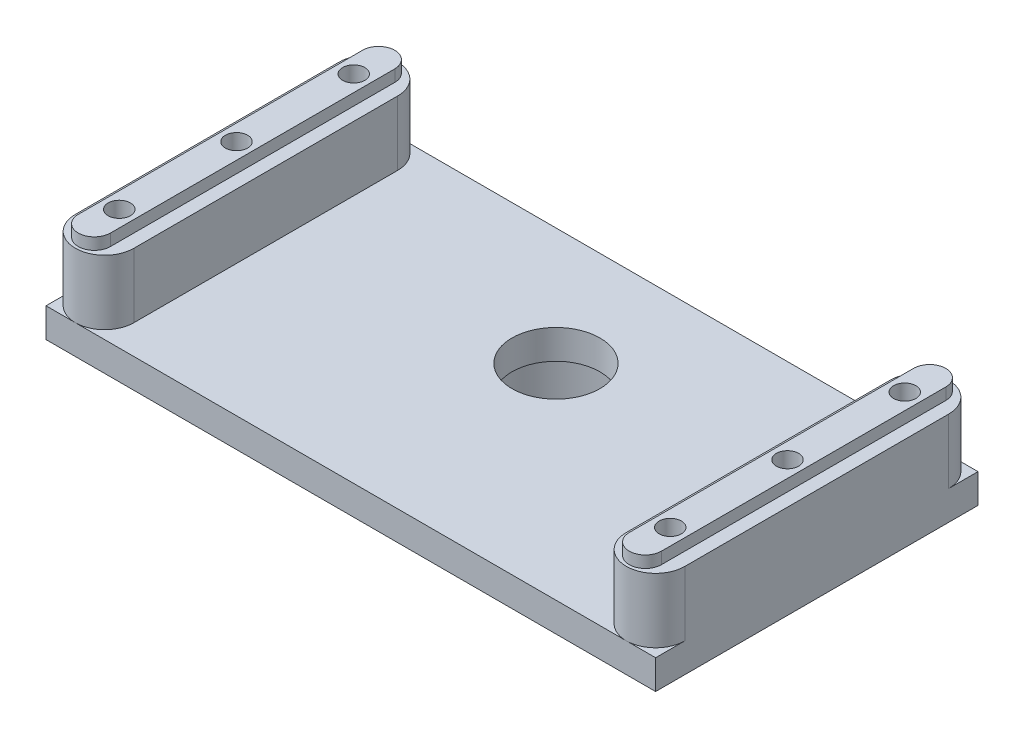
ISO-10303-21;
HEADER;
FILE_DESCRIPTION(('STEP AP214'),'2;1');
FILE_NAME('part.step','',(''),(''),'','','');
FILE_SCHEMA(('AUTOMOTIVE_DESIGN { 1 0 10303 214 1 1 1 1 }'));
ENDSEC;
DATA;
#1=APPLICATION_CONTEXT('core data for automotive mechanical design processes');
#2=APPLICATION_PROTOCOL_DEFINITION('international standard','automotive_design',2000,#1);
#3=PRODUCT_CONTEXT('',#1,'mechanical');
#4=PRODUCT('Part','Part','',(#3));
#5=PRODUCT_RELATED_PRODUCT_CATEGORY('part','',(#4));
#6=PRODUCT_DEFINITION_FORMATION('','',#4);
#7=PRODUCT_DEFINITION_CONTEXT('part definition',#1,'design');
#8=PRODUCT_DEFINITION('design','',#6,#7);
#9=PRODUCT_DEFINITION_SHAPE('','',#8);
#10=(LENGTH_UNIT() NAMED_UNIT(*) SI_UNIT(.MILLI.,.METRE.));
#11=(NAMED_UNIT(*) PLANE_ANGLE_UNIT() SI_UNIT($,.RADIAN.));
#12=(NAMED_UNIT(*) SI_UNIT($,.STERADIAN.) SOLID_ANGLE_UNIT());
#13=UNCERTAINTY_MEASURE_WITH_UNIT(LENGTH_MEASURE(1.E-05),#10,'distance_accuracy_value','');
#14=(GEOMETRIC_REPRESENTATION_CONTEXT(3) GLOBAL_UNCERTAINTY_ASSIGNED_CONTEXT((#13)) GLOBAL_UNIT_ASSIGNED_CONTEXT((#10,
#11,#12)) REPRESENTATION_CONTEXT('',''));
#15=CARTESIAN_POINT('',(0.,0.,0.));
#16=DIRECTION('',(0.,0.,1.));
#17=DIRECTION('',(1.,0.,0.));
#18=AXIS2_PLACEMENT_3D('',#15,#16,#17);
#19=CARTESIAN_POINT('',(47.,16.,22.5));
#20=DIRECTION('',(0.,1.,0.));
#21=DIRECTION('',(0.,0.,1.));
#22=AXIS2_PLACEMENT_3D('',#19,#20,#21);
#23=PLANE('',#22);
#24=CARTESIAN_POINT('',(47.,16.,22.5));
#25=DIRECTION('',(0.,1.,0.));
#26=DIRECTION('',(0.,0.,1.));
#27=AXIS2_PLACEMENT_3D('',#24,#25,#26);
#28=CIRCLE('',#27,5.);
#29=CARTESIAN_POINT('',(42.,16.,22.5));
#30=VERTEX_POINT('',#29);
#31=CARTESIAN_POINT('',(52.,16.,22.5));
#32=VERTEX_POINT('',#31);
#33=EDGE_CURVE('E241',#30,#32,#28,.T.);
#34=ORIENTED_EDGE('',*,*,#33,.T.);
#35=DIRECTION('',(0.,0.,-1.));
#36=VECTOR('',#35,1.);
#37=CARTESIAN_POINT('',(52.,16.,22.5));
#38=LINE('',#37,#36);
#39=CARTESIAN_POINT('',(52.,16.,-22.5));
#40=VERTEX_POINT('',#39);
#41=EDGE_CURVE('E244',#32,#40,#38,.T.);
#42=ORIENTED_EDGE('',*,*,#41,.T.);
#43=CARTESIAN_POINT('',(47.,16.,-22.5));
#44=DIRECTION('',(0.,1.,0.));
#45=DIRECTION('',(0.,0.,1.));
#46=AXIS2_PLACEMENT_3D('',#43,#44,#45);
#47=CIRCLE('',#46,5.);
#48=CARTESIAN_POINT('',(42.,16.,-22.5));
#49=VERTEX_POINT('',#48);
#50=EDGE_CURVE('E247',#40,#49,#47,.T.);
#51=ORIENTED_EDGE('',*,*,#50,.T.);
#52=DIRECTION('',(0.,0.,1.));
#53=VECTOR('',#52,1.);
#54=CARTESIAN_POINT('',(42.,16.,22.5));
#55=LINE('',#54,#53);
#56=EDGE_CURVE('E249',#49,#30,#55,.T.);
#57=ORIENTED_EDGE('',*,*,#56,.T.);
#58=EDGE_LOOP('',(#34,#42,#51,#57));
#59=FACE_BOUND('',#58,.T.);
#60=DIRECTION('',(0.,0.,-1.));
#61=VECTOR('',#60,1.);
#62=CARTESIAN_POINT('',(49.75,16.,24.25));
#63=LINE('',#62,#61);
#64=CARTESIAN_POINT('',(49.75,16.,24.25));
#65=VERTEX_POINT('',#64);
#66=CARTESIAN_POINT('',(49.75,16.,-24.25));
#67=VERTEX_POINT('',#66);
#68=EDGE_CURVE('E551',#65,#67,#63,.T.);
#69=ORIENTED_EDGE('',*,*,#68,.F.);
#70=CARTESIAN_POINT('',(47.,16.,24.25));
#71=DIRECTION('',(0.,1.,0.));
#72=DIRECTION('',(0.,0.,1.));
#73=AXIS2_PLACEMENT_3D('',#70,#71,#72);
#74=CIRCLE('',#73,2.75);
#75=CARTESIAN_POINT('',(44.25,16.,24.25));
#76=VERTEX_POINT('',#75);
#77=EDGE_CURVE('E207',#76,#65,#74,.T.);
#78=ORIENTED_EDGE('',*,*,#77,.F.);
#79=DIRECTION('',(0.,0.,1.));
#80=VECTOR('',#79,1.);
#81=CARTESIAN_POINT('',(44.25,16.,24.25));
#82=LINE('',#81,#80);
#83=CARTESIAN_POINT('',(44.25,16.,-24.25));
#84=VERTEX_POINT('',#83);
#85=EDGE_CURVE('E203',#84,#76,#82,.T.);
#86=ORIENTED_EDGE('',*,*,#85,.F.);
#87=CARTESIAN_POINT('',(47.,16.,-24.25));
#88=DIRECTION('',(0.,1.,0.));
#89=DIRECTION('',(0.,0.,1.));
#90=AXIS2_PLACEMENT_3D('',#87,#88,#89);
#91=CIRCLE('',#90,2.75);
#92=EDGE_CURVE('E553',#67,#84,#91,.T.);
#93=ORIENTED_EDGE('',*,*,#92,.F.);
#94=EDGE_LOOP('',(#69,#78,#86,#93));
#95=FACE_BOUND('',#94,.T.);
#96=ADVANCED_FACE('F33',(#59,#95),#23,.T.);
#97=CARTESIAN_POINT('',(-47.,16.,22.5));
#98=DIRECTION('',(0.,1.,0.));
#99=DIRECTION('',(0.,0.,1.));
#100=AXIS2_PLACEMENT_3D('',#97,#98,#99);
#101=PLANE('',#100);
#102=CARTESIAN_POINT('',(-47.,16.,22.5));
#103=DIRECTION('',(0.,1.,0.));
#104=DIRECTION('',(0.,0.,1.));
#105=AXIS2_PLACEMENT_3D('',#102,#103,#104);
#106=CIRCLE('',#105,5.);
#107=CARTESIAN_POINT('',(-52.,16.,22.5));
#108=VERTEX_POINT('',#107);
#109=CARTESIAN_POINT('',(-42.,16.,22.5));
#110=VERTEX_POINT('',#109);
#111=EDGE_CURVE('E273',#108,#110,#106,.T.);
#112=ORIENTED_EDGE('',*,*,#111,.T.);
#113=DIRECTION('',(0.,0.,-1.));
#114=VECTOR('',#113,1.);
#115=CARTESIAN_POINT('',(-42.,16.,22.5));
#116=LINE('',#115,#114);
#117=CARTESIAN_POINT('',(-42.,16.,-22.5));
#118=VERTEX_POINT('',#117);
#119=EDGE_CURVE('E276',#110,#118,#116,.T.);
#120=ORIENTED_EDGE('',*,*,#119,.T.);
#121=CARTESIAN_POINT('',(-47.,16.,-22.5));
#122=DIRECTION('',(0.,1.,0.));
#123=DIRECTION('',(0.,0.,1.));
#124=AXIS2_PLACEMENT_3D('',#121,#122,#123);
#125=CIRCLE('',#124,5.);
#126=CARTESIAN_POINT('',(-52.,16.,-22.5));
#127=VERTEX_POINT('',#126);
#128=EDGE_CURVE('E279',#118,#127,#125,.T.);
#129=ORIENTED_EDGE('',*,*,#128,.T.);
#130=DIRECTION('',(0.,0.,1.));
#131=VECTOR('',#130,1.);
#132=CARTESIAN_POINT('',(-52.,16.,22.5));
#133=LINE('',#132,#131);
#134=EDGE_CURVE('E281',#127,#108,#133,.T.);
#135=ORIENTED_EDGE('',*,*,#134,.T.);
#136=EDGE_LOOP('',(#112,#120,#129,#135));
#137=FACE_BOUND('',#136,.T.);
#138=DIRECTION('',(0.,0.,-1.));
#139=VECTOR('',#138,1.);
#140=CARTESIAN_POINT('',(-44.25,16.,24.25));
#141=LINE('',#140,#139);
#142=CARTESIAN_POINT('',(-44.25,16.,24.25));
#143=VERTEX_POINT('',#142);
#144=CARTESIAN_POINT('',(-44.25,16.,-24.25));
#145=VERTEX_POINT('',#144);
#146=EDGE_CURVE('E212',#143,#145,#141,.T.);
#147=ORIENTED_EDGE('',*,*,#146,.F.);
#148=CARTESIAN_POINT('',(-47.,16.,24.25));
#149=DIRECTION('',(0.,1.,0.));
#150=DIRECTION('',(0.,0.,1.));
#151=AXIS2_PLACEMENT_3D('',#148,#149,#150);
#152=CIRCLE('',#151,2.75000000000001);
#153=CARTESIAN_POINT('',(-49.75,16.,24.25));
#154=VERTEX_POINT('',#153);
#155=EDGE_CURVE('E209',#154,#143,#152,.T.);
#156=ORIENTED_EDGE('',*,*,#155,.F.);
#157=DIRECTION('',(0.,0.,1.));
#158=VECTOR('',#157,1.);
#159=CARTESIAN_POINT('',(-49.75,16.,24.25));
#160=LINE('',#159,#158);
#161=CARTESIAN_POINT('',(-49.75,16.,-24.25));
#162=VERTEX_POINT('',#161);
#163=EDGE_CURVE('E221',#162,#154,#160,.T.);
#164=ORIENTED_EDGE('',*,*,#163,.F.);
#165=CARTESIAN_POINT('',(-47.,16.,-24.25));
#166=DIRECTION('',(0.,1.,0.));
#167=DIRECTION('',(0.,0.,1.));
#168=AXIS2_PLACEMENT_3D('',#165,#166,#167);
#169=CIRCLE('',#168,2.75000000000001);
#170=EDGE_CURVE('E229',#145,#162,#169,.T.);
#171=ORIENTED_EDGE('',*,*,#170,.F.);
#172=EDGE_LOOP('',(#147,#156,#164,#171));
#173=FACE_BOUND('',#172,.T.);
#174=ADVANCED_FACE('F419',(#137,#173),#101,.T.);
#175=CARTESIAN_POINT('',(0.,5.,0.));
#176=DIRECTION('',(0.,-1.,0.));
#177=DIRECTION('',(0.,0.,-1.));
#178=AXIS2_PLACEMENT_3D('',#175,#176,#177);
#179=PLANE('',#178);
#180=CARTESIAN_POINT('',(47.,5.,-22.5));
#181=DIRECTION('',(0.,1.,0.));
#182=DIRECTION('',(0.,0.,1.));
#183=AXIS2_PLACEMENT_3D('',#180,#181,#182);
#184=CIRCLE('',#183,5.);
#185=CARTESIAN_POINT('',(52.,5.,-22.5));
#186=VERTEX_POINT('',#185);
#187=CARTESIAN_POINT('',(47.,5.,-27.5));
#188=VERTEX_POINT('',#187);
#189=EDGE_CURVE('E256',#186,#188,#184,.T.);
#190=ORIENTED_EDGE('',*,*,#189,.F.);
#191=DIRECTION('',(0.,0.,-1.));
#192=VECTOR('',#191,1.);
#193=CARTESIAN_POINT('',(52.,5.,27.5));
#194=LINE('',#193,#192);
#195=CARTESIAN_POINT('',(52.,5.,-27.5));
#196=VERTEX_POINT('',#195);
#197=EDGE_CURVE('E324',#186,#196,#194,.T.);
#198=ORIENTED_EDGE('',*,*,#197,.T.);
#199=DIRECTION('',(-1.,0.,0.));
#200=VECTOR('',#199,1.);
#201=CARTESIAN_POINT('',(-52.,5.,-27.5));
#202=LINE('',#201,#200);
#203=EDGE_CURVE('E325',#196,#188,#202,.T.);
#204=ORIENTED_EDGE('',*,*,#203,.T.);
#205=EDGE_LOOP('',(#190,#198,#204));
#206=FACE_BOUND('',#205,.T.);
#207=ADVANCED_FACE('F373',(#206),#179,.F.);
#208=CARTESIAN_POINT('',(47.,5.,22.5));
#209=DIRECTION('',(0.,1.,0.));
#210=DIRECTION('',(0.,0.,1.));
#211=AXIS2_PLACEMENT_3D('',#208,#209,#210);
#212=CIRCLE('',#211,5.);
#213=CARTESIAN_POINT('',(47.,5.,27.5));
#214=VERTEX_POINT('',#213);
#215=CARTESIAN_POINT('',(52.,5.,22.5));
#216=VERTEX_POINT('',#215);
#217=EDGE_CURVE('E240',#214,#216,#212,.T.);
#218=ORIENTED_EDGE('',*,*,#217,.F.);
#219=DIRECTION('',(1.,0.,0.));
#220=VECTOR('',#219,1.);
#221=CARTESIAN_POINT('',(-52.,5.,27.5));
#222=LINE('',#221,#220);
#223=CARTESIAN_POINT('',(52.,5.,27.5));
#224=VERTEX_POINT('',#223);
#225=EDGE_CURVE('E338',#214,#224,#222,.T.);
#226=ORIENTED_EDGE('',*,*,#225,.T.);
#227=EDGE_CURVE('E321',#224,#216,#194,.T.);
#228=ORIENTED_EDGE('',*,*,#227,.T.);
#229=EDGE_LOOP('',(#218,#226,#228));
#230=FACE_BOUND('',#229,.T.);
#231=ADVANCED_FACE('F391',(#230),#179,.F.);
#232=CARTESIAN_POINT('',(0.,5.,-7.5));
#233=DIRECTION('',(0.,-1.,0.));
#234=DIRECTION('',(0.,0.,-1.));
#235=AXIS2_PLACEMENT_3D('',#232,#233,#234);
#236=CIRCLE('',#235,7.5);
#237=CARTESIAN_POINT('',(0.,5.,-15.));
#238=VERTEX_POINT('',#237);
#239=EDGE_CURVE('E497',#238,#238,#236,.T.);
#240=ORIENTED_EDGE('',*,*,#239,.T.);
#241=EDGE_LOOP('',(#240));
#242=FACE_BOUND('',#241,.T.);
#243=CARTESIAN_POINT('',(42.,5.,22.5));
#244=VERTEX_POINT('',#243);
#245=EDGE_CURVE('E252',#244,#214,#212,.T.);
#246=ORIENTED_EDGE('',*,*,#245,.F.);
#247=DIRECTION('',(0.,0.,1.));
#248=VECTOR('',#247,1.);
#249=CARTESIAN_POINT('',(42.,5.,22.5));
#250=LINE('',#249,#248);
#251=CARTESIAN_POINT('',(42.,5.,-22.5));
#252=VERTEX_POINT('',#251);
#253=EDGE_CURVE('E245',#252,#244,#250,.T.);
#254=ORIENTED_EDGE('',*,*,#253,.F.);
#255=EDGE_CURVE('E255',#188,#252,#184,.T.);
#256=ORIENTED_EDGE('',*,*,#255,.F.);
#257=CARTESIAN_POINT('',(-47.,5.,-27.5));
#258=VERTEX_POINT('',#257);
#259=EDGE_CURVE('E329',#188,#258,#202,.T.);
#260=ORIENTED_EDGE('',*,*,#259,.T.);
#261=CARTESIAN_POINT('',(-47.,5.,-22.5));
#262=DIRECTION('',(0.,1.,0.));
#263=DIRECTION('',(0.,0.,1.));
#264=AXIS2_PLACEMENT_3D('',#261,#262,#263);
#265=CIRCLE('',#264,5.);
#266=CARTESIAN_POINT('',(-42.,5.,-22.5));
#267=VERTEX_POINT('',#266);
#268=EDGE_CURVE('E277',#267,#258,#265,.T.);
#269=ORIENTED_EDGE('',*,*,#268,.F.);
#270=DIRECTION('',(0.,0.,-1.));
#271=VECTOR('',#270,1.);
#272=CARTESIAN_POINT('',(-42.,5.,22.5));
#273=LINE('',#272,#271);
#274=CARTESIAN_POINT('',(-42.,5.,22.5));
#275=VERTEX_POINT('',#274);
#276=EDGE_CURVE('E289',#275,#267,#273,.T.);
#277=ORIENTED_EDGE('',*,*,#276,.F.);
#278=CARTESIAN_POINT('',(-47.,5.,22.5));
#279=DIRECTION('',(0.,1.,0.));
#280=DIRECTION('',(0.,0.,1.));
#281=AXIS2_PLACEMENT_3D('',#278,#279,#280);
#282=CIRCLE('',#281,5.);
#283=CARTESIAN_POINT('',(-47.,5.,27.5));
#284=VERTEX_POINT('',#283);
#285=EDGE_CURVE('E284',#284,#275,#282,.T.);
#286=ORIENTED_EDGE('',*,*,#285,.F.);
#287=EDGE_CURVE('E397',#284,#214,#222,.T.);
#288=ORIENTED_EDGE('',*,*,#287,.T.);
#289=EDGE_LOOP('',(#246,#254,#256,#260,#269,#277,#286,#288));
#290=FACE_BOUND('',#289,.T.);
#291=ADVANCED_FACE('F400',(#242,#290),#179,.F.);
#292=CARTESIAN_POINT('',(-52.,5.,-22.5));
#293=VERTEX_POINT('',#292);
#294=EDGE_CURVE('E42',#258,#293,#265,.T.);
#295=ORIENTED_EDGE('',*,*,#294,.F.);
#296=CARTESIAN_POINT('',(-52.,5.,-27.5));
#297=VERTEX_POINT('',#296);
#298=EDGE_CURVE('E323',#258,#297,#202,.T.);
#299=ORIENTED_EDGE('',*,*,#298,.T.);
#300=DIRECTION('',(0.,0.,1.));
#301=VECTOR('',#300,1.);
#302=CARTESIAN_POINT('',(-52.,5.,27.5));
#303=LINE('',#302,#301);
#304=EDGE_CURVE('E336',#297,#293,#303,.T.);
#305=ORIENTED_EDGE('',*,*,#304,.T.);
#306=EDGE_LOOP('',(#295,#299,#305));
#307=FACE_BOUND('',#306,.T.);
#308=ADVANCED_FACE('F471',(#307),#179,.F.);
#309=CARTESIAN_POINT('',(-52.,5.,22.5));
#310=VERTEX_POINT('',#309);
#311=EDGE_CURVE('E272',#310,#284,#282,.T.);
#312=ORIENTED_EDGE('',*,*,#311,.F.);
#313=CARTESIAN_POINT('',(-52.,5.,27.5));
#314=VERTEX_POINT('',#313);
#315=EDGE_CURVE('E328',#310,#314,#303,.T.);
#316=ORIENTED_EDGE('',*,*,#315,.T.);
#317=EDGE_CURVE('E332',#314,#284,#222,.T.);
#318=ORIENTED_EDGE('',*,*,#317,.T.);
#319=EDGE_LOOP('',(#312,#316,#318));
#320=FACE_BOUND('',#319,.T.);
#321=ADVANCED_FACE('F402',(#320),#179,.F.);
#322=CARTESIAN_POINT('',(52.,5.,27.5));
#323=DIRECTION('',(-1.,0.,0.));
#324=DIRECTION('',(0.,0.,1.));
#325=AXIS2_PLACEMENT_3D('',#322,#323,#324);
#326=PLANE('',#325);
#327=DIRECTION('',(0.,0.,-1.));
#328=VECTOR('',#327,1.);
#329=CARTESIAN_POINT('',(52.,0.,27.5));
#330=LINE('',#329,#328);
#331=CARTESIAN_POINT('',(52.,0.,27.5));
#332=VERTEX_POINT('',#331);
#333=CARTESIAN_POINT('',(52.,0.,-27.5));
#334=VERTEX_POINT('',#333);
#335=EDGE_CURVE('E317',#332,#334,#330,.T.);
#336=ORIENTED_EDGE('',*,*,#335,.T.);
#337=DIRECTION('',(0.,-1.,0.));
#338=VECTOR('',#337,1.);
#339=CARTESIAN_POINT('',(52.,5.,-27.5));
#340=LINE('',#339,#338);
#341=EDGE_CURVE('E288',#196,#334,#340,.T.);
#342=ORIENTED_EDGE('',*,*,#341,.F.);
#343=ORIENTED_EDGE('',*,*,#197,.F.);
#344=DIRECTION('',(0.,-1.,0.));
#345=VECTOR('',#344,1.);
#346=CARTESIAN_POINT('',(52.,16.,-22.5));
#347=LINE('',#346,#345);
#348=EDGE_CURVE('E266',#40,#186,#347,.T.);
#349=ORIENTED_EDGE('',*,*,#348,.F.);
#350=ORIENTED_EDGE('',*,*,#41,.F.);
#351=DIRECTION('',(0.,-1.,0.));
#352=VECTOR('',#351,1.);
#353=CARTESIAN_POINT('',(52.,16.,22.5));
#354=LINE('',#353,#352);
#355=EDGE_CURVE('E269',#32,#216,#354,.T.);
#356=ORIENTED_EDGE('',*,*,#355,.T.);
#357=ORIENTED_EDGE('',*,*,#227,.F.);
#358=DIRECTION('',(0.,-1.,0.));
#359=VECTOR('',#358,1.);
#360=CARTESIAN_POINT('',(52.,5.,27.5));
#361=LINE('',#360,#359);
#362=EDGE_CURVE('E347',#224,#332,#361,.T.);
#363=ORIENTED_EDGE('',*,*,#362,.T.);
#364=EDGE_LOOP('',(#336,#342,#343,#349,#350,#356,#357,#363));
#365=FACE_BOUND('',#364,.T.);
#366=ADVANCED_FACE('F35',(#365),#326,.F.);
#367=CARTESIAN_POINT('',(-52.,5.,-27.5));
#368=DIRECTION('',(0.,0.,1.));
#369=DIRECTION('',(1.,0.,0.));
#370=AXIS2_PLACEMENT_3D('',#367,#368,#369);
#371=PLANE('',#370);
#372=DIRECTION('',(-1.,0.,0.));
#373=VECTOR('',#372,1.);
#374=CARTESIAN_POINT('',(-52.,0.,-27.5));
#375=LINE('',#374,#373);
#376=CARTESIAN_POINT('',(-52.,0.,-27.5));
#377=VERTEX_POINT('',#376);
#378=EDGE_CURVE('E354',#334,#377,#375,.T.);
#379=ORIENTED_EDGE('',*,*,#378,.T.);
#380=DIRECTION('',(0.,-1.,0.));
#381=VECTOR('',#380,1.);
#382=CARTESIAN_POINT('',(-52.,5.,-27.5));
#383=LINE('',#382,#381);
#384=EDGE_CURVE('E341',#297,#377,#383,.T.);
#385=ORIENTED_EDGE('',*,*,#384,.F.);
#386=ORIENTED_EDGE('',*,*,#298,.F.);
#387=ORIENTED_EDGE('',*,*,#259,.F.);
#388=ORIENTED_EDGE('',*,*,#203,.F.);
#389=ORIENTED_EDGE('',*,*,#341,.T.);
#390=EDGE_LOOP('',(#379,#385,#386,#387,#388,#389));
#391=FACE_BOUND('',#390,.T.);
#392=ADVANCED_FACE('F368',(#391),#371,.F.);
#393=CARTESIAN_POINT('',(-52.,5.,27.5));
#394=DIRECTION('',(1.,0.,0.));
#395=DIRECTION('',(0.,0.,-1.));
#396=AXIS2_PLACEMENT_3D('',#393,#394,#395);
#397=PLANE('',#396);
#398=DIRECTION('',(0.,0.,1.));
#399=VECTOR('',#398,1.);
#400=CARTESIAN_POINT('',(-52.,0.,27.5));
#401=LINE('',#400,#399);
#402=CARTESIAN_POINT('',(-52.,0.,27.5));
#403=VERTEX_POINT('',#402);
#404=EDGE_CURVE('E352',#377,#403,#401,.T.);
#405=ORIENTED_EDGE('',*,*,#404,.T.);
#406=DIRECTION('',(0.,-1.,0.));
#407=VECTOR('',#406,1.);
#408=CARTESIAN_POINT('',(-52.,5.,27.5));
#409=LINE('',#408,#407);
#410=EDGE_CURVE('E344',#314,#403,#409,.T.);
#411=ORIENTED_EDGE('',*,*,#410,.F.);
#412=ORIENTED_EDGE('',*,*,#315,.F.);
#413=DIRECTION('',(0.,-1.,0.));
#414=VECTOR('',#413,1.);
#415=CARTESIAN_POINT('',(-52.,16.,22.5));
#416=LINE('',#415,#414);
#417=EDGE_CURVE('E283',#108,#310,#416,.T.);
#418=ORIENTED_EDGE('',*,*,#417,.F.);
#419=ORIENTED_EDGE('',*,*,#134,.F.);
#420=DIRECTION('',(0.,-1.,0.));
#421=VECTOR('',#420,1.);
#422=CARTESIAN_POINT('',(-52.,16.,-22.5));
#423=LINE('',#422,#421);
#424=EDGE_CURVE('E298',#127,#293,#423,.T.);
#425=ORIENTED_EDGE('',*,*,#424,.T.);
#426=ORIENTED_EDGE('',*,*,#304,.F.);
#427=ORIENTED_EDGE('',*,*,#384,.T.);
#428=EDGE_LOOP('',(#405,#411,#412,#418,#419,#425,#426,#427));
#429=FACE_BOUND('',#428,.T.);
#430=ADVANCED_FACE('F410',(#429),#397,.F.);
#431=CARTESIAN_POINT('',(-52.,5.,27.5));
#432=DIRECTION('',(0.,0.,-1.));
#433=DIRECTION('',(-1.,0.,0.));
#434=AXIS2_PLACEMENT_3D('',#431,#432,#433);
#435=PLANE('',#434);
#436=DIRECTION('',(1.,0.,0.));
#437=VECTOR('',#436,1.);
#438=CARTESIAN_POINT('',(-52.,0.,27.5));
#439=LINE('',#438,#437);
#440=EDGE_CURVE('E350',#403,#332,#439,.T.);
#441=ORIENTED_EDGE('',*,*,#440,.T.);
#442=ORIENTED_EDGE('',*,*,#362,.F.);
#443=ORIENTED_EDGE('',*,*,#225,.F.);
#444=ORIENTED_EDGE('',*,*,#287,.F.);
#445=ORIENTED_EDGE('',*,*,#317,.F.);
#446=ORIENTED_EDGE('',*,*,#410,.T.);
#447=EDGE_LOOP('',(#441,#442,#443,#444,#445,#446));
#448=FACE_BOUND('',#447,.T.);
#449=ADVANCED_FACE('F395',(#448),#435,.F.);
#450=CARTESIAN_POINT('',(0.,0.,0.));
#451=DIRECTION('',(0.,-1.,0.));
#452=DIRECTION('',(0.,0.,-1.));
#453=AXIS2_PLACEMENT_3D('',#450,#451,#452);
#454=PLANE('',#453);
#455=CARTESIAN_POINT('',(0.,0.,-7.5));
#456=DIRECTION('',(0.,-1.,0.));
#457=DIRECTION('',(0.,0.,-1.));
#458=AXIS2_PLACEMENT_3D('',#455,#456,#457);
#459=CIRCLE('',#458,17.25);
#460=CARTESIAN_POINT('',(0.,0.,-24.75));
#461=VERTEX_POINT('',#460);
#462=EDGE_CURVE('E502',#461,#461,#459,.T.);
#463=ORIENTED_EDGE('',*,*,#462,.F.);
#464=EDGE_LOOP('',(#463));
#465=FACE_BOUND('',#464,.T.);
#466=CARTESIAN_POINT('',(47.0000000000002,0.,20.));
#467=DIRECTION('',(0.,-1.,0.));
#468=DIRECTION('',(0.,0.,-1.));
#469=AXIS2_PLACEMENT_3D('',#466,#467,#468);
#470=CIRCLE('',#469,1.9);
#471=CARTESIAN_POINT('',(47.0000000000002,0.,18.1));
#472=VERTEX_POINT('',#471);
#473=EDGE_CURVE('E514',#472,#472,#470,.T.);
#474=ORIENTED_EDGE('',*,*,#473,.F.);
#475=EDGE_LOOP('',(#474));
#476=FACE_BOUND('',#475,.T.);
#477=CARTESIAN_POINT('',(46.9999999999999,0.,-20.));
#478=DIRECTION('',(0.,-1.,0.));
#479=DIRECTION('',(0.,0.,-1.));
#480=AXIS2_PLACEMENT_3D('',#477,#478,#479);
#481=CIRCLE('',#480,1.9);
#482=CARTESIAN_POINT('',(46.9999999999999,0.,-21.9));
#483=VERTEX_POINT('',#482);
#484=EDGE_CURVE('E520',#483,#483,#481,.T.);
#485=ORIENTED_EDGE('',*,*,#484,.F.);
#486=EDGE_LOOP('',(#485));
#487=FACE_BOUND('',#486,.T.);
#488=CARTESIAN_POINT('',(47.,0.,0.));
#489=DIRECTION('',(0.,-1.,0.));
#490=DIRECTION('',(0.,0.,-1.));
#491=AXIS2_PLACEMENT_3D('',#488,#489,#490);
#492=CIRCLE('',#491,1.9);
#493=CARTESIAN_POINT('',(47.,0.,-1.9));
#494=VERTEX_POINT('',#493);
#495=EDGE_CURVE('E526',#494,#494,#492,.T.);
#496=ORIENTED_EDGE('',*,*,#495,.F.);
#497=EDGE_LOOP('',(#496));
#498=FACE_BOUND('',#497,.T.);
#499=CARTESIAN_POINT('',(-46.9999999999998,0.,20.));
#500=DIRECTION('',(0.,-1.,0.));
#501=DIRECTION('',(0.,0.,-1.));
#502=AXIS2_PLACEMENT_3D('',#499,#500,#501);
#503=CIRCLE('',#502,1.9);
#504=CARTESIAN_POINT('',(-46.9999999999998,0.,18.1));
#505=VERTEX_POINT('',#504);
#506=EDGE_CURVE('E532',#505,#505,#503,.T.);
#507=ORIENTED_EDGE('',*,*,#506,.F.);
#508=EDGE_LOOP('',(#507));
#509=FACE_BOUND('',#508,.T.);
#510=CARTESIAN_POINT('',(-47.0000000000001,0.,-20.));
#511=DIRECTION('',(0.,-1.,0.));
#512=DIRECTION('',(0.,0.,-1.));
#513=AXIS2_PLACEMENT_3D('',#510,#511,#512);
#514=CIRCLE('',#513,1.9);
#515=CARTESIAN_POINT('',(-47.0000000000001,0.,-21.9));
#516=VERTEX_POINT('',#515);
#517=EDGE_CURVE('E538',#516,#516,#514,.T.);
#518=ORIENTED_EDGE('',*,*,#517,.F.);
#519=EDGE_LOOP('',(#518));
#520=FACE_BOUND('',#519,.T.);
#521=CARTESIAN_POINT('',(-47.,0.,0.));
#522=DIRECTION('',(0.,-1.,0.));
#523=DIRECTION('',(0.,0.,-1.));
#524=AXIS2_PLACEMENT_3D('',#521,#522,#523);
#525=CIRCLE('',#524,1.9);
#526=CARTESIAN_POINT('',(-47.,0.,-1.9));
#527=VERTEX_POINT('',#526);
#528=EDGE_CURVE('E544',#527,#527,#525,.T.);
#529=ORIENTED_EDGE('',*,*,#528,.F.);
#530=EDGE_LOOP('',(#529));
#531=FACE_BOUND('',#530,.T.);
#532=ORIENTED_EDGE('',*,*,#335,.F.);
#533=ORIENTED_EDGE('',*,*,#440,.F.);
#534=ORIENTED_EDGE('',*,*,#404,.F.);
#535=ORIENTED_EDGE('',*,*,#378,.F.);
#536=EDGE_LOOP('',(#532,#533,#534,#535));
#537=FACE_BOUND('',#536,.T.);
#538=ADVANCED_FACE('F363',(#465,#476,#487,#498,#509,#520,#531,#537),#454,.T.);
#539=CARTESIAN_POINT('',(-47.,16.,22.5));
#540=DIRECTION('',(0.,-1.,0.));
#541=DIRECTION('',(0.,0.,-1.));
#542=AXIS2_PLACEMENT_3D('',#539,#540,#541);
#543=CYLINDRICAL_SURFACE('',#542,5.);
#544=ORIENTED_EDGE('',*,*,#311,.T.);
#545=ORIENTED_EDGE('',*,*,#285,.T.);
#546=DIRECTION('',(0.,-1.,0.));
#547=VECTOR('',#546,1.);
#548=CARTESIAN_POINT('',(-42.,16.,22.5));
#549=LINE('',#548,#547);
#550=EDGE_CURVE('E310',#110,#275,#549,.T.);
#551=ORIENTED_EDGE('',*,*,#550,.F.);
#552=ORIENTED_EDGE('',*,*,#111,.F.);
#553=ORIENTED_EDGE('',*,*,#417,.T.);
#554=EDGE_LOOP('',(#544,#545,#551,#552,#553));
#555=FACE_BOUND('',#554,.T.);
#556=ADVANCED_FACE('F406',(#555),#543,.T.);
#557=CARTESIAN_POINT('',(-42.,16.,22.5));
#558=DIRECTION('',(-1.,0.,0.));
#559=DIRECTION('',(0.,0.,1.));
#560=AXIS2_PLACEMENT_3D('',#557,#558,#559);
#561=PLANE('',#560);
#562=ORIENTED_EDGE('',*,*,#276,.T.);
#563=DIRECTION('',(0.,-1.,0.));
#564=VECTOR('',#563,1.);
#565=CARTESIAN_POINT('',(-42.,16.,-22.5));
#566=LINE('',#565,#564);
#567=EDGE_CURVE('E303',#118,#267,#566,.T.);
#568=ORIENTED_EDGE('',*,*,#567,.F.);
#569=ORIENTED_EDGE('',*,*,#119,.F.);
#570=ORIENTED_EDGE('',*,*,#550,.T.);
#571=EDGE_LOOP('',(#562,#568,#569,#570));
#572=FACE_BOUND('',#571,.T.);
#573=ADVANCED_FACE('F417',(#572),#561,.F.);
#574=CARTESIAN_POINT('',(-47.,16.,-22.5));
#575=DIRECTION('',(0.,-1.,0.));
#576=DIRECTION('',(0.,0.,-1.));
#577=AXIS2_PLACEMENT_3D('',#574,#575,#576);
#578=CYLINDRICAL_SURFACE('',#577,5.);
#579=ORIENTED_EDGE('',*,*,#268,.T.);
#580=ORIENTED_EDGE('',*,*,#294,.T.);
#581=ORIENTED_EDGE('',*,*,#424,.F.);
#582=ORIENTED_EDGE('',*,*,#128,.F.);
#583=ORIENTED_EDGE('',*,*,#567,.T.);
#584=EDGE_LOOP('',(#579,#580,#581,#582,#583));
#585=FACE_BOUND('',#584,.T.);
#586=ADVANCED_FACE('F414',(#585),#578,.T.);
#587=CARTESIAN_POINT('',(47.,16.,22.5));
#588=DIRECTION('',(0.,-1.,0.));
#589=DIRECTION('',(0.,0.,-1.));
#590=AXIS2_PLACEMENT_3D('',#587,#588,#589);
#591=CYLINDRICAL_SURFACE('',#590,5.);
#592=ORIENTED_EDGE('',*,*,#245,.T.);
#593=ORIENTED_EDGE('',*,*,#217,.T.);
#594=ORIENTED_EDGE('',*,*,#355,.F.);
#595=ORIENTED_EDGE('',*,*,#33,.F.);
#596=DIRECTION('',(0.,-1.,0.));
#597=VECTOR('',#596,1.);
#598=CARTESIAN_POINT('',(42.,16.,22.5));
#599=LINE('',#598,#597);
#600=EDGE_CURVE('E251',#30,#244,#599,.T.);
#601=ORIENTED_EDGE('',*,*,#600,.T.);
#602=EDGE_LOOP('',(#592,#593,#594,#595,#601));
#603=FACE_BOUND('',#602,.T.);
#604=ADVANCED_FACE('F388',(#603),#591,.T.);
#605=CARTESIAN_POINT('',(47.,16.,-22.5));
#606=DIRECTION('',(0.,-1.,0.));
#607=DIRECTION('',(0.,0.,-1.));
#608=AXIS2_PLACEMENT_3D('',#605,#606,#607);
#609=CYLINDRICAL_SURFACE('',#608,5.);
#610=ORIENTED_EDGE('',*,*,#189,.T.);
#611=ORIENTED_EDGE('',*,*,#255,.T.);
#612=DIRECTION('',(0.,-1.,0.));
#613=VECTOR('',#612,1.);
#614=CARTESIAN_POINT('',(42.,16.,-22.5));
#615=LINE('',#614,#613);
#616=EDGE_CURVE('E263',#49,#252,#615,.T.);
#617=ORIENTED_EDGE('',*,*,#616,.F.);
#618=ORIENTED_EDGE('',*,*,#50,.F.);
#619=ORIENTED_EDGE('',*,*,#348,.T.);
#620=EDGE_LOOP('',(#610,#611,#617,#618,#619));
#621=FACE_BOUND('',#620,.T.);
#622=ADVANCED_FACE('F376',(#621),#609,.T.);
#623=CARTESIAN_POINT('',(42.,16.,22.5));
#624=DIRECTION('',(1.,0.,0.));
#625=DIRECTION('',(0.,0.,-1.));
#626=AXIS2_PLACEMENT_3D('',#623,#624,#625);
#627=PLANE('',#626);
#628=ORIENTED_EDGE('',*,*,#253,.T.);
#629=ORIENTED_EDGE('',*,*,#600,.F.);
#630=ORIENTED_EDGE('',*,*,#56,.F.);
#631=ORIENTED_EDGE('',*,*,#616,.T.);
#632=EDGE_LOOP('',(#628,#629,#630,#631));
#633=FACE_BOUND('',#632,.T.);
#634=ADVANCED_FACE('F457',(#633),#627,.F.);
#635=CARTESIAN_POINT('',(-47.,18.,24.25));
#636=DIRECTION('',(0.,-1.,0.));
#637=DIRECTION('',(0.,0.,-1.));
#638=AXIS2_PLACEMENT_3D('',#635,#636,#637);
#639=CYLINDRICAL_SURFACE('',#638,2.75000000000001);
#640=ORIENTED_EDGE('',*,*,#155,.T.);
#641=DIRECTION('',(0.,-1.,0.));
#642=VECTOR('',#641,1.);
#643=CARTESIAN_POINT('',(-44.25,18.,24.25));
#644=LINE('',#643,#642);
#645=CARTESIAN_POINT('',(-44.25,18.,24.25));
#646=VERTEX_POINT('',#645);
#647=EDGE_CURVE('E238',#646,#143,#644,.T.);
#648=ORIENTED_EDGE('',*,*,#647,.F.);
#649=CARTESIAN_POINT('',(-47.,18.,24.25));
#650=DIRECTION('',(0.,1.,0.));
#651=DIRECTION('',(0.,0.,1.));
#652=AXIS2_PLACEMENT_3D('',#649,#650,#651);
#653=CIRCLE('',#652,2.75000000000001);
#654=CARTESIAN_POINT('',(-49.75,18.,24.25));
#655=VERTEX_POINT('',#654);
#656=EDGE_CURVE('E217',#655,#646,#653,.T.);
#657=ORIENTED_EDGE('',*,*,#656,.F.);
#658=DIRECTION('',(0.,-1.,0.));
#659=VECTOR('',#658,1.);
#660=CARTESIAN_POINT('',(-49.75,18.,24.25));
#661=LINE('',#660,#659);
#662=EDGE_CURVE('E226',#655,#154,#661,.T.);
#663=ORIENTED_EDGE('',*,*,#662,.T.);
#664=EDGE_LOOP('',(#640,#648,#657,#663));
#665=FACE_BOUND('',#664,.T.);
#666=ADVANCED_FACE('F439',(#665),#639,.T.);
#667=CARTESIAN_POINT('',(-44.25,18.,24.25));
#668=DIRECTION('',(-1.,0.,0.));
#669=DIRECTION('',(0.,0.,1.));
#670=AXIS2_PLACEMENT_3D('',#667,#668,#669);
#671=PLANE('',#670);
#672=ORIENTED_EDGE('',*,*,#146,.T.);
#673=DIRECTION('',(0.,-1.,0.));
#674=VECTOR('',#673,1.);
#675=CARTESIAN_POINT('',(-44.25,18.,-24.25));
#676=LINE('',#675,#674);
#677=CARTESIAN_POINT('',(-44.25,18.,-24.25));
#678=VERTEX_POINT('',#677);
#679=EDGE_CURVE('E235',#678,#145,#676,.T.);
#680=ORIENTED_EDGE('',*,*,#679,.F.);
#681=DIRECTION('',(0.,0.,-1.));
#682=VECTOR('',#681,1.);
#683=CARTESIAN_POINT('',(-44.25,18.,24.25));
#684=LINE('',#683,#682);
#685=EDGE_CURVE('E220',#646,#678,#684,.T.);
#686=ORIENTED_EDGE('',*,*,#685,.F.);
#687=ORIENTED_EDGE('',*,*,#647,.T.);
#688=EDGE_LOOP('',(#672,#680,#686,#687));
#689=FACE_BOUND('',#688,.T.);
#690=ADVANCED_FACE('F429',(#689),#671,.F.);
#691=CARTESIAN_POINT('',(-47.,18.,-24.25));
#692=DIRECTION('',(0.,-1.,0.));
#693=DIRECTION('',(0.,0.,-1.));
#694=AXIS2_PLACEMENT_3D('',#691,#692,#693);
#695=CYLINDRICAL_SURFACE('',#694,2.75000000000001);
#696=ORIENTED_EDGE('',*,*,#170,.T.);
#697=DIRECTION('',(0.,-1.,0.));
#698=VECTOR('',#697,1.);
#699=CARTESIAN_POINT('',(-49.75,18.,-24.25));
#700=LINE('',#699,#698);
#701=CARTESIAN_POINT('',(-49.75,18.,-24.25));
#702=VERTEX_POINT('',#701);
#703=EDGE_CURVE('E57',#702,#162,#700,.T.);
#704=ORIENTED_EDGE('',*,*,#703,.F.);
#705=CARTESIAN_POINT('',(-47.,18.,-24.25));
#706=DIRECTION('',(0.,1.,0.));
#707=DIRECTION('',(0.,0.,1.));
#708=AXIS2_PLACEMENT_3D('',#705,#706,#707);
#709=CIRCLE('',#708,2.75000000000001);
#710=EDGE_CURVE('E223',#678,#702,#709,.T.);
#711=ORIENTED_EDGE('',*,*,#710,.F.);
#712=ORIENTED_EDGE('',*,*,#679,.T.);
#713=EDGE_LOOP('',(#696,#704,#711,#712));
#714=FACE_BOUND('',#713,.T.);
#715=ADVANCED_FACE('F433',(#714),#695,.T.);
#716=CARTESIAN_POINT('',(-49.75,18.,24.25));
#717=DIRECTION('',(1.,0.,0.));
#718=DIRECTION('',(0.,0.,-1.));
#719=AXIS2_PLACEMENT_3D('',#716,#717,#718);
#720=PLANE('',#719);
#721=ORIENTED_EDGE('',*,*,#163,.T.);
#722=ORIENTED_EDGE('',*,*,#662,.F.);
#723=DIRECTION('',(0.,0.,1.));
#724=VECTOR('',#723,1.);
#725=CARTESIAN_POINT('',(-49.75,18.,24.25));
#726=LINE('',#725,#724);
#727=EDGE_CURVE('E225',#702,#655,#726,.T.);
#728=ORIENTED_EDGE('',*,*,#727,.F.);
#729=ORIENTED_EDGE('',*,*,#703,.T.);
#730=EDGE_LOOP('',(#721,#722,#728,#729));
#731=FACE_BOUND('',#730,.T.);
#732=ADVANCED_FACE('F440',(#731),#720,.F.);
#733=CARTESIAN_POINT('',(-47.,18.,24.25));
#734=DIRECTION('',(0.,1.,0.));
#735=DIRECTION('',(0.,0.,1.));
#736=AXIS2_PLACEMENT_3D('',#733,#734,#735);
#737=PLANE('',#736);
#738=CARTESIAN_POINT('',(-46.9999999999998,18.,20.));
#739=DIRECTION('',(0.,1.,0.));
#740=DIRECTION('',(0.,0.,1.));
#741=AXIS2_PLACEMENT_3D('',#738,#739,#740);
#742=CIRCLE('',#741,1.9);
#743=CARTESIAN_POINT('',(-46.9999999999998,18.,21.9));
#744=VERTEX_POINT('',#743);
#745=EDGE_CURVE('E529',#744,#744,#742,.T.);
#746=ORIENTED_EDGE('',*,*,#745,.F.);
#747=EDGE_LOOP('',(#746));
#748=FACE_BOUND('',#747,.T.);
#749=CARTESIAN_POINT('',(-47.0000000000001,18.,-20.));
#750=DIRECTION('',(0.,1.,0.));
#751=DIRECTION('',(0.,0.,1.));
#752=AXIS2_PLACEMENT_3D('',#749,#750,#751);
#753=CIRCLE('',#752,1.9);
#754=CARTESIAN_POINT('',(-47.0000000000001,18.,-18.1));
#755=VERTEX_POINT('',#754);
#756=EDGE_CURVE('E535',#755,#755,#753,.T.);
#757=ORIENTED_EDGE('',*,*,#756,.F.);
#758=EDGE_LOOP('',(#757));
#759=FACE_BOUND('',#758,.T.);
#760=CARTESIAN_POINT('',(-47.,18.,0.));
#761=DIRECTION('',(0.,1.,0.));
#762=DIRECTION('',(0.,0.,1.));
#763=AXIS2_PLACEMENT_3D('',#760,#761,#762);
#764=CIRCLE('',#763,1.9);
#765=CARTESIAN_POINT('',(-47.,18.,1.9));
#766=VERTEX_POINT('',#765);
#767=EDGE_CURVE('E541',#766,#766,#764,.T.);
#768=ORIENTED_EDGE('',*,*,#767,.F.);
#769=EDGE_LOOP('',(#768));
#770=FACE_BOUND('',#769,.T.);
#771=ORIENTED_EDGE('',*,*,#656,.T.);
#772=ORIENTED_EDGE('',*,*,#685,.T.);
#773=ORIENTED_EDGE('',*,*,#710,.T.);
#774=ORIENTED_EDGE('',*,*,#727,.T.);
#775=EDGE_LOOP('',(#771,#772,#773,#774));
#776=FACE_BOUND('',#775,.T.);
#777=ADVANCED_FACE('F435',(#748,#759,#770,#776),#737,.T.);
#778=CARTESIAN_POINT('',(47.,18.,24.25));
#779=DIRECTION('',(0.,-1.,0.));
#780=DIRECTION('',(0.,0.,-1.));
#781=AXIS2_PLACEMENT_3D('',#778,#779,#780);
#782=CYLINDRICAL_SURFACE('',#781,2.75);
#783=ORIENTED_EDGE('',*,*,#77,.T.);
#784=DIRECTION('',(0.,-1.,0.));
#785=VECTOR('',#784,1.);
#786=CARTESIAN_POINT('',(49.75,18.,24.25));
#787=LINE('',#786,#785);
#788=CARTESIAN_POINT('',(49.75,18.,24.25));
#789=VERTEX_POINT('',#788);
#790=EDGE_CURVE('E188',#789,#65,#787,.T.);
#791=ORIENTED_EDGE('',*,*,#790,.F.);
#792=CARTESIAN_POINT('',(47.,18.,24.25));
#793=DIRECTION('',(0.,1.,0.));
#794=DIRECTION('',(0.,0.,1.));
#795=AXIS2_PLACEMENT_3D('',#792,#793,#794);
#796=CIRCLE('',#795,2.75);
#797=CARTESIAN_POINT('',(44.25,18.,24.25));
#798=VERTEX_POINT('',#797);
#799=EDGE_CURVE('E195',#798,#789,#796,.T.);
#800=ORIENTED_EDGE('',*,*,#799,.F.);
#801=DIRECTION('',(0.,-1.,0.));
#802=VECTOR('',#801,1.);
#803=CARTESIAN_POINT('',(44.25,18.,24.25));
#804=LINE('',#803,#802);
#805=EDGE_CURVE('E549',#798,#76,#804,.T.);
#806=ORIENTED_EDGE('',*,*,#805,.T.);
#807=EDGE_LOOP('',(#783,#791,#800,#806));
#808=FACE_BOUND('',#807,.T.);
#809=ADVANCED_FACE('F205',(#808),#782,.T.);
#810=CARTESIAN_POINT('',(49.75,18.,24.25));
#811=DIRECTION('',(-1.,0.,0.));
#812=DIRECTION('',(0.,0.,1.));
#813=AXIS2_PLACEMENT_3D('',#810,#811,#812);
#814=PLANE('',#813);
#815=ORIENTED_EDGE('',*,*,#68,.T.);
#816=DIRECTION('',(0.,-1.,0.));
#817=VECTOR('',#816,1.);
#818=CARTESIAN_POINT('',(49.75,18.,-24.25));
#819=LINE('',#818,#817);
#820=CARTESIAN_POINT('',(49.75,18.,-24.25));
#821=VERTEX_POINT('',#820);
#822=EDGE_CURVE('E191',#821,#67,#819,.T.);
#823=ORIENTED_EDGE('',*,*,#822,.F.);
#824=DIRECTION('',(0.,0.,-1.));
#825=VECTOR('',#824,1.);
#826=CARTESIAN_POINT('',(49.75,18.,24.25));
#827=LINE('',#826,#825);
#828=EDGE_CURVE('E184',#789,#821,#827,.T.);
#829=ORIENTED_EDGE('',*,*,#828,.F.);
#830=ORIENTED_EDGE('',*,*,#790,.T.);
#831=EDGE_LOOP('',(#815,#823,#829,#830));
#832=FACE_BOUND('',#831,.T.);
#833=ADVANCED_FACE('F186',(#832),#814,.F.);
#834=CARTESIAN_POINT('',(47.,18.,-24.25));
#835=DIRECTION('',(0.,-1.,0.));
#836=DIRECTION('',(0.,0.,-1.));
#837=AXIS2_PLACEMENT_3D('',#834,#835,#836);
#838=CYLINDRICAL_SURFACE('',#837,2.75);
#839=ORIENTED_EDGE('',*,*,#92,.T.);
#840=DIRECTION('',(0.,-1.,0.));
#841=VECTOR('',#840,1.);
#842=CARTESIAN_POINT('',(44.25,18.,-24.25));
#843=LINE('',#842,#841);
#844=CARTESIAN_POINT('',(44.25,18.,-24.25));
#845=VERTEX_POINT('',#844);
#846=EDGE_CURVE('E49',#845,#84,#843,.T.);
#847=ORIENTED_EDGE('',*,*,#846,.F.);
#848=CARTESIAN_POINT('',(47.,18.,-24.25));
#849=DIRECTION('',(0.,1.,0.));
#850=DIRECTION('',(0.,0.,1.));
#851=AXIS2_PLACEMENT_3D('',#848,#849,#850);
#852=CIRCLE('',#851,2.75);
#853=EDGE_CURVE('E194',#821,#845,#852,.T.);
#854=ORIENTED_EDGE('',*,*,#853,.F.);
#855=ORIENTED_EDGE('',*,*,#822,.T.);
#856=EDGE_LOOP('',(#839,#847,#854,#855));
#857=FACE_BOUND('',#856,.T.);
#858=ADVANCED_FACE('F559',(#857),#838,.T.);
#859=CARTESIAN_POINT('',(44.25,18.,24.25));
#860=DIRECTION('',(1.,0.,0.));
#861=DIRECTION('',(0.,0.,-1.));
#862=AXIS2_PLACEMENT_3D('',#859,#860,#861);
#863=PLANE('',#862);
#864=ORIENTED_EDGE('',*,*,#85,.T.);
#865=ORIENTED_EDGE('',*,*,#805,.F.);
#866=DIRECTION('',(0.,0.,1.));
#867=VECTOR('',#866,1.);
#868=CARTESIAN_POINT('',(44.25,18.,24.25));
#869=LINE('',#868,#867);
#870=EDGE_CURVE('E199',#845,#798,#869,.T.);
#871=ORIENTED_EDGE('',*,*,#870,.F.);
#872=ORIENTED_EDGE('',*,*,#846,.T.);
#873=EDGE_LOOP('',(#864,#865,#871,#872));
#874=FACE_BOUND('',#873,.T.);
#875=ADVANCED_FACE('F560',(#874),#863,.F.);
#876=CARTESIAN_POINT('',(47.,18.,24.25));
#877=DIRECTION('',(0.,1.,0.));
#878=DIRECTION('',(0.,0.,1.));
#879=AXIS2_PLACEMENT_3D('',#876,#877,#878);
#880=PLANE('',#879);
#881=CARTESIAN_POINT('',(47.0000000000002,18.,20.));
#882=DIRECTION('',(0.,1.,0.));
#883=DIRECTION('',(0.,0.,1.));
#884=AXIS2_PLACEMENT_3D('',#881,#882,#883);
#885=CIRCLE('',#884,1.9);
#886=CARTESIAN_POINT('',(47.0000000000002,18.,21.9));
#887=VERTEX_POINT('',#886);
#888=EDGE_CURVE('E509',#887,#887,#885,.T.);
#889=ORIENTED_EDGE('',*,*,#888,.F.);
#890=EDGE_LOOP('',(#889));
#891=FACE_BOUND('',#890,.T.);
#892=CARTESIAN_POINT('',(46.9999999999999,18.,-20.));
#893=DIRECTION('',(0.,1.,0.));
#894=DIRECTION('',(0.,0.,1.));
#895=AXIS2_PLACEMENT_3D('',#892,#893,#894);
#896=CIRCLE('',#895,1.9);
#897=CARTESIAN_POINT('',(46.9999999999999,18.,-18.1));
#898=VERTEX_POINT('',#897);
#899=EDGE_CURVE('E517',#898,#898,#896,.T.);
#900=ORIENTED_EDGE('',*,*,#899,.F.);
#901=EDGE_LOOP('',(#900));
#902=FACE_BOUND('',#901,.T.);
#903=CARTESIAN_POINT('',(47.,18.,0.));
#904=DIRECTION('',(0.,1.,0.));
#905=DIRECTION('',(0.,0.,1.));
#906=AXIS2_PLACEMENT_3D('',#903,#904,#905);
#907=CIRCLE('',#906,1.9);
#908=CARTESIAN_POINT('',(47.,18.,1.9));
#909=VERTEX_POINT('',#908);
#910=EDGE_CURVE('E523',#909,#909,#907,.T.);
#911=ORIENTED_EDGE('',*,*,#910,.F.);
#912=EDGE_LOOP('',(#911));
#913=FACE_BOUND('',#912,.T.);
#914=ORIENTED_EDGE('',*,*,#799,.T.);
#915=ORIENTED_EDGE('',*,*,#828,.T.);
#916=ORIENTED_EDGE('',*,*,#853,.T.);
#917=ORIENTED_EDGE('',*,*,#870,.T.);
#918=EDGE_LOOP('',(#914,#915,#916,#917));
#919=FACE_BOUND('',#918,.T.);
#920=ADVANCED_FACE('F198',(#891,#902,#913,#919),#880,.T.);
#921=CARTESIAN_POINT('',(-47.,-5.00000000000001,0.));
#922=DIRECTION('',(0.,1.,0.));
#923=DIRECTION('',(0.,0.,1.));
#924=AXIS2_PLACEMENT_3D('',#921,#922,#923);
#925=CYLINDRICAL_SURFACE('',#924,1.9);
#926=ORIENTED_EDGE('',*,*,#528,.T.);
#927=EDGE_LOOP('',(#926));
#928=FACE_BOUND('',#927,.T.);
#929=ORIENTED_EDGE('',*,*,#767,.T.);
#930=EDGE_LOOP('',(#929));
#931=FACE_BOUND('',#930,.T.);
#932=ADVANCED_FACE('F567',(#928,#931),#925,.F.);
#933=CARTESIAN_POINT('',(-47.0000000000001,-5.00000000000001,-20.));
#934=DIRECTION('',(0.,1.,0.));
#935=DIRECTION('',(0.,0.,1.));
#936=AXIS2_PLACEMENT_3D('',#933,#934,#935);
#937=CYLINDRICAL_SURFACE('',#936,1.9);
#938=ORIENTED_EDGE('',*,*,#517,.T.);
#939=EDGE_LOOP('',(#938));
#940=FACE_BOUND('',#939,.T.);
#941=ORIENTED_EDGE('',*,*,#756,.T.);
#942=EDGE_LOOP('',(#941));
#943=FACE_BOUND('',#942,.T.);
#944=ADVANCED_FACE('F612',(#940,#943),#937,.F.);
#945=CARTESIAN_POINT('',(-46.9999999999998,-5.00000000000001,20.));
#946=DIRECTION('',(0.,1.,0.));
#947=DIRECTION('',(0.,0.,1.));
#948=AXIS2_PLACEMENT_3D('',#945,#946,#947);
#949=CYLINDRICAL_SURFACE('',#948,1.9);
#950=ORIENTED_EDGE('',*,*,#506,.T.);
#951=EDGE_LOOP('',(#950));
#952=FACE_BOUND('',#951,.T.);
#953=ORIENTED_EDGE('',*,*,#745,.T.);
#954=EDGE_LOOP('',(#953));
#955=FACE_BOUND('',#954,.T.);
#956=ADVANCED_FACE('F621',(#952,#955),#949,.F.);
#957=CARTESIAN_POINT('',(47.,-5.00000000000001,0.));
#958=DIRECTION('',(0.,1.,0.));
#959=DIRECTION('',(0.,0.,1.));
#960=AXIS2_PLACEMENT_3D('',#957,#958,#959);
#961=CYLINDRICAL_SURFACE('',#960,1.9);
#962=ORIENTED_EDGE('',*,*,#495,.T.);
#963=EDGE_LOOP('',(#962));
#964=FACE_BOUND('',#963,.T.);
#965=ORIENTED_EDGE('',*,*,#910,.T.);
#966=EDGE_LOOP('',(#965));
#967=FACE_BOUND('',#966,.T.);
#968=ADVANCED_FACE('F631',(#964,#967),#961,.F.);
#969=CARTESIAN_POINT('',(46.9999999999999,-5.00000000000001,-20.));
#970=DIRECTION('',(0.,1.,0.));
#971=DIRECTION('',(0.,0.,1.));
#972=AXIS2_PLACEMENT_3D('',#969,#970,#971);
#973=CYLINDRICAL_SURFACE('',#972,1.9);
#974=ORIENTED_EDGE('',*,*,#484,.T.);
#975=EDGE_LOOP('',(#974));
#976=FACE_BOUND('',#975,.T.);
#977=ORIENTED_EDGE('',*,*,#899,.T.);
#978=EDGE_LOOP('',(#977));
#979=FACE_BOUND('',#978,.T.);
#980=ADVANCED_FACE('F641',(#976,#979),#973,.F.);
#981=CARTESIAN_POINT('',(47.0000000000002,-5.00000000000001,20.));
#982=DIRECTION('',(0.,1.,0.));
#983=DIRECTION('',(0.,0.,1.));
#984=AXIS2_PLACEMENT_3D('',#981,#982,#983);
#985=CYLINDRICAL_SURFACE('',#984,1.9);
#986=ORIENTED_EDGE('',*,*,#473,.T.);
#987=EDGE_LOOP('',(#986));
#988=FACE_BOUND('',#987,.T.);
#989=ORIENTED_EDGE('',*,*,#888,.T.);
#990=EDGE_LOOP('',(#989));
#991=FACE_BOUND('',#990,.T.);
#992=ADVANCED_FACE('F651',(#988,#991),#985,.F.);
#993=CARTESIAN_POINT('',(0.,-10.,-7.5));
#994=DIRECTION('',(0.,-1.,0.));
#995=DIRECTION('',(0.,0.,-1.));
#996=AXIS2_PLACEMENT_3D('',#993,#994,#995);
#997=PLANE('',#996);
#998=CARTESIAN_POINT('',(0.,-10.,-7.5));
#999=DIRECTION('',(0.,-1.,0.));
#1000=DIRECTION('',(0.,0.,-1.));
#1001=AXIS2_PLACEMENT_3D('',#998,#999,#1000);
#1002=CIRCLE('',#1001,17.25);
#1003=CARTESIAN_POINT('',(0.,-10.,-24.75));
#1004=VERTEX_POINT('',#1003);
#1005=EDGE_CURVE('E506',#1004,#1004,#1002,.T.);
#1006=ORIENTED_EDGE('',*,*,#1005,.T.);
#1007=EDGE_LOOP('',(#1006));
#1008=FACE_BOUND('',#1007,.T.);
#1009=CARTESIAN_POINT('',(0.,-10.,-7.5));
#1010=DIRECTION('',(0.,-1.,0.));
#1011=DIRECTION('',(0.,0.,-1.));
#1012=AXIS2_PLACEMENT_3D('',#1009,#1010,#1011);
#1013=CIRCLE('',#1012,12.75);
#1014=CARTESIAN_POINT('',(0.,-10.,-20.25));
#1015=VERTEX_POINT('',#1014);
#1016=EDGE_CURVE('E499',#1015,#1015,#1013,.T.);
#1017=ORIENTED_EDGE('',*,*,#1016,.F.);
#1018=EDGE_LOOP('',(#1017));
#1019=FACE_BOUND('',#1018,.T.);
#1020=ADVANCED_FACE('F661',(#1008,#1019),#997,.T.);
#1021=CARTESIAN_POINT('',(0.,-10.,-7.5));
#1022=DIRECTION('',(0.,1.,0.));
#1023=DIRECTION('',(0.,0.,1.));
#1024=AXIS2_PLACEMENT_3D('',#1021,#1022,#1023);
#1025=CYLINDRICAL_SURFACE('',#1024,17.25);
#1026=ORIENTED_EDGE('',*,*,#1005,.F.);
#1027=EDGE_LOOP('',(#1026));
#1028=FACE_BOUND('',#1027,.T.);
#1029=ORIENTED_EDGE('',*,*,#462,.T.);
#1030=EDGE_LOOP('',(#1029));
#1031=FACE_BOUND('',#1030,.T.);
#1032=ADVANCED_FACE('F680',(#1028,#1031),#1025,.T.);
#1033=CARTESIAN_POINT('',(0.,-10.,-7.5));
#1034=DIRECTION('',(0.,1.,0.));
#1035=DIRECTION('',(0.,0.,1.));
#1036=AXIS2_PLACEMENT_3D('',#1033,#1034,#1035);
#1037=CYLINDRICAL_SURFACE('',#1036,12.75);
#1038=ORIENTED_EDGE('',*,*,#1016,.T.);
#1039=EDGE_LOOP('',(#1038));
#1040=FACE_BOUND('',#1039,.T.);
#1041=CARTESIAN_POINT('',(0.,0.,-7.5));
#1042=DIRECTION('',(0.,-1.,0.));
#1043=DIRECTION('',(0.,0.,-1.));
#1044=AXIS2_PLACEMENT_3D('',#1041,#1042,#1043);
#1045=CIRCLE('',#1044,12.75);
#1046=CARTESIAN_POINT('',(0.,0.,-20.25));
#1047=VERTEX_POINT('',#1046);
#1048=EDGE_CURVE('E11',#1047,#1047,#1045,.F.);
#1049=ORIENTED_EDGE('',*,*,#1048,.T.);
#1050=EDGE_LOOP('',(#1049));
#1051=FACE_BOUND('',#1050,.T.);
#1052=ADVANCED_FACE('F690',(#1040,#1051),#1037,.F.);
#1053=CARTESIAN_POINT('',(0.,0.,-7.5));
#1054=DIRECTION('',(0.,-1.,0.));
#1055=DIRECTION('',(0.,0.,-1.));
#1056=AXIS2_PLACEMENT_3D('',#1053,#1054,#1055);
#1057=CIRCLE('',#1056,7.5);
#1058=CARTESIAN_POINT('',(0.,0.,-15.));
#1059=VERTEX_POINT('',#1058);
#1060=EDGE_CURVE('E37',#1059,#1059,#1057,.T.);
#1061=ORIENTED_EDGE('',*,*,#1060,.F.);
#1062=EDGE_LOOP('',(#1061));
#1063=FACE_BOUND('',#1062,.T.);
#1064=ORIENTED_EDGE('',*,*,#1048,.F.);
#1065=EDGE_LOOP('',(#1064));
#1066=FACE_BOUND('',#1065,.T.);
#1067=ADVANCED_FACE('F477',(#1063,#1066),#454,.T.);
#1068=CARTESIAN_POINT('',(0.,25.,-7.5));
#1069=DIRECTION('',(0.,-1.,0.));
#1070=DIRECTION('',(0.,0.,-1.));
#1071=AXIS2_PLACEMENT_3D('',#1068,#1069,#1070);
#1072=CYLINDRICAL_SURFACE('',#1071,7.5);
#1073=ORIENTED_EDGE('',*,*,#1060,.T.);
#1074=EDGE_LOOP('',(#1073));
#1075=FACE_BOUND('',#1074,.T.);
#1076=ORIENTED_EDGE('',*,*,#239,.F.);
#1077=EDGE_LOOP('',(#1076));
#1078=FACE_BOUND('',#1077,.T.);
#1079=ADVANCED_FACE('F715',(#1075,#1078),#1072,.F.);
#1080=CLOSED_SHELL('',(#96,#174,#207,#231,#291,#308,#321,#366,#392,#430,#449,#538,#556,#573,
#586,#604,#622,#634,#666,#690,#715,#732,#777,#809,#833,#858,#875,#920,#932,#944,#956,#968,#980,
#992,#1020,#1032,#1052,#1067,#1079));
#1081=MANIFOLD_SOLID_BREP('B2',#1080);
#1082=ADVANCED_BREP_SHAPE_REPRESENTATION('',(#18,#1081),#14);
#1083=SHAPE_DEFINITION_REPRESENTATION(#9,#1082);
ENDSEC;
END-ISO-10303-21;
